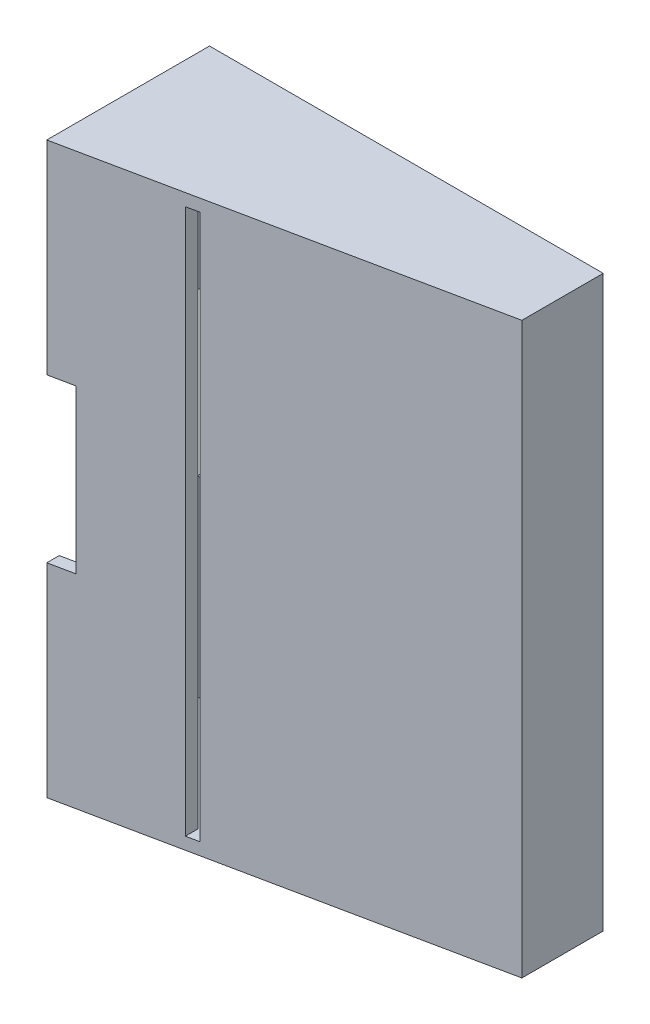
ISO-10303-21;
HEADER;
FILE_DESCRIPTION(('STEP AP214'),'2;1');
FILE_NAME('part.step','',(''),(''),'','','');
FILE_SCHEMA(('AUTOMOTIVE_DESIGN { 1 0 10303 214 1 1 1 1 }'));
ENDSEC;
DATA;
#1=APPLICATION_CONTEXT('core data for automotive mechanical design processes');
#2=APPLICATION_PROTOCOL_DEFINITION('international standard','automotive_design',2000,#1);
#3=PRODUCT_CONTEXT('',#1,'mechanical');
#4=PRODUCT('Part','Part','',(#3));
#5=PRODUCT_RELATED_PRODUCT_CATEGORY('part','',(#4));
#6=PRODUCT_DEFINITION_FORMATION('','',#4);
#7=PRODUCT_DEFINITION_CONTEXT('part definition',#1,'design');
#8=PRODUCT_DEFINITION('design','',#6,#7);
#9=PRODUCT_DEFINITION_SHAPE('','',#8);
#10=(LENGTH_UNIT() NAMED_UNIT(*) SI_UNIT(.MILLI.,.METRE.));
#11=(NAMED_UNIT(*) PLANE_ANGLE_UNIT() SI_UNIT($,.RADIAN.));
#12=(NAMED_UNIT(*) SI_UNIT($,.STERADIAN.) SOLID_ANGLE_UNIT());
#13=UNCERTAINTY_MEASURE_WITH_UNIT(LENGTH_MEASURE(1.E-05),#10,'distance_accuracy_value','');
#14=(GEOMETRIC_REPRESENTATION_CONTEXT(3) GLOBAL_UNCERTAINTY_ASSIGNED_CONTEXT((#13)) GLOBAL_UNIT_ASSIGNED_CONTEXT((#10,
#11,#12)) REPRESENTATION_CONTEXT('',''));
#15=CARTESIAN_POINT('',(0.,0.,0.));
#16=DIRECTION('',(0.,0.,1.));
#17=DIRECTION('',(1.,0.,0.));
#18=AXIS2_PLACEMENT_3D('',#15,#16,#17);
#19=CARTESIAN_POINT('',(0.,0.,0.));
#20=DIRECTION('',(0.,0.,1.));
#21=DIRECTION('',(1.,0.,0.));
#22=AXIS2_PLACEMENT_3D('',#19,#20,#21);
#23=PLANE('',#22);
#24=DIRECTION('',(1.,0.,0.));
#25=VECTOR('',#24,1.);
#26=CARTESIAN_POINT('',(0.,35.2499999999999,0.));
#27=LINE('',#26,#25);
#28=CARTESIAN_POINT('',(-46.8874953737982,35.2499999999999,0.));
#29=VERTEX_POINT('',#28);
#30=CARTESIAN_POINT('',(-43.8874953737976,35.2499999999999,0.));
#31=VERTEX_POINT('',#30);
#32=EDGE_CURVE('E325',#29,#31,#27,.T.);
#33=ORIENTED_EDGE('',*,*,#32,.F.);
#34=DIRECTION('',(0.,-1.,0.));
#35=VECTOR('',#34,1.);
#36=CARTESIAN_POINT('',(-46.8874953737991,1.23631995211119E-12,0.));
#37=LINE('',#36,#35);
#38=CARTESIAN_POINT('',(-46.8874953737975,60.2499999999998,0.));
#39=VERTEX_POINT('',#38);
#40=EDGE_CURVE('E329',#39,#29,#37,.T.);
#41=ORIENTED_EDGE('',*,*,#40,.F.);
#42=DIRECTION('',(-1.,0.,0.));
#43=VECTOR('',#42,1.);
#44=CARTESIAN_POINT('',(0.,60.2499999999998,0.));
#45=LINE('',#44,#43);
#46=CARTESIAN_POINT('',(1.5,60.2499999999998,0.));
#47=VERTEX_POINT('',#46);
#48=EDGE_CURVE('E348',#47,#39,#45,.T.);
#49=ORIENTED_EDGE('',*,*,#48,.F.);
#50=DIRECTION('',(0.,1.,0.));
#51=VECTOR('',#50,1.);
#52=CARTESIAN_POINT('',(1.5,0.,0.));
#53=LINE('',#52,#51);
#54=CARTESIAN_POINT('',(1.5,-9.75000000000003,0.));
#55=VERTEX_POINT('',#54);
#56=EDGE_CURVE('E345',#55,#47,#53,.T.);
#57=ORIENTED_EDGE('',*,*,#56,.F.);
#58=DIRECTION('',(1.,0.,0.));
#59=VECTOR('',#58,1.);
#60=CARTESIAN_POINT('',(0.,-9.75000000000003,0.));
#61=LINE('',#60,#59);
#62=CARTESIAN_POINT('',(-46.8874953737985,-9.75000000000003,0.));
#63=VERTEX_POINT('',#62);
#64=EDGE_CURVE('E342',#63,#55,#61,.T.);
#65=ORIENTED_EDGE('',*,*,#64,.F.);
#66=DIRECTION('',(0.,-1.,0.));
#67=VECTOR('',#66,1.);
#68=CARTESIAN_POINT('',(-46.8874953737985,3.2534735581873E-13,0.));
#69=LINE('',#68,#67);
#70=CARTESIAN_POINT('',(-46.8874953737983,15.2499999999999,0.));
#71=VERTEX_POINT('',#70);
#72=EDGE_CURVE('E340',#71,#63,#69,.T.);
#73=ORIENTED_EDGE('',*,*,#72,.F.);
#74=DIRECTION('',(-1.,0.,0.));
#75=VECTOR('',#74,1.);
#76=CARTESIAN_POINT('',(0.,15.2499999999998,0.));
#77=LINE('',#76,#75);
#78=CARTESIAN_POINT('',(-43.8874953737976,15.2499999999999,0.));
#79=VERTEX_POINT('',#78);
#80=EDGE_CURVE('E337',#79,#71,#77,.T.);
#81=ORIENTED_EDGE('',*,*,#80,.F.);
#82=DIRECTION('',(0.,-1.,0.));
#83=VECTOR('',#82,1.);
#84=CARTESIAN_POINT('',(-43.8874953737976,0.,0.));
#85=LINE('',#84,#83);
#86=EDGE_CURVE('E334',#31,#79,#85,.T.);
#87=ORIENTED_EDGE('',*,*,#86,.F.);
#88=EDGE_LOOP('',(#33,#41,#49,#57,#65,#73,#81,#87));
#89=FACE_BOUND('',#88,.T.);
#90=DIRECTION('',(-1.,0.,0.));
#91=VECTOR('',#90,1.);
#92=CARTESIAN_POINT('',(0.,-8.25000000000003,0.));
#93=LINE('',#92,#91);
#94=CARTESIAN_POINT('',(-31.27,-8.25000000000003,0.));
#95=VERTEX_POINT('',#94);
#96=CARTESIAN_POINT('',(-32.77,-8.25000000000003,0.));
#97=VERTEX_POINT('',#96);
#98=EDGE_CURVE('E224',#95,#97,#93,.T.);
#99=ORIENTED_EDGE('',*,*,#98,.F.);
#100=DIRECTION('',(0.,1.,0.));
#101=VECTOR('',#100,1.);
#102=CARTESIAN_POINT('',(-31.27,0.,0.));
#103=LINE('',#102,#101);
#104=CARTESIAN_POINT('',(-31.27,58.7499999999998,0.));
#105=VERTEX_POINT('',#104);
#106=EDGE_CURVE('E228',#95,#105,#103,.T.);
#107=ORIENTED_EDGE('',*,*,#106,.T.);
#108=DIRECTION('',(1.,0.,0.));
#109=VECTOR('',#108,1.);
#110=CARTESIAN_POINT('',(0.,58.7499999999998,0.));
#111=LINE('',#110,#109);
#112=CARTESIAN_POINT('',(-32.77,58.7499999999998,0.));
#113=VERTEX_POINT('',#112);
#114=EDGE_CURVE('E60',#113,#105,#111,.T.);
#115=ORIENTED_EDGE('',*,*,#114,.F.);
#116=DIRECTION('',(0.,1.,0.));
#117=VECTOR('',#116,1.);
#118=CARTESIAN_POINT('',(-32.77,0.,0.));
#119=LINE('',#118,#117);
#120=EDGE_CURVE('E217',#97,#113,#119,.T.);
#121=ORIENTED_EDGE('',*,*,#120,.F.);
#122=EDGE_LOOP('',(#99,#107,#115,#121));
#123=FACE_BOUND('',#122,.T.);
#124=ADVANCED_FACE('F45',(#89,#123),#23,.F.);
#125=CARTESIAN_POINT('',(2.04343913529051,60.2509999999998,9.8876901705508));
#126=DIRECTION('',(-0.202388113855779,0.,-0.979305392290832));
#127=DIRECTION('',(-0.979305392290832,0.,0.202388113855779));
#128=AXIS2_PLACEMENT_3D('',#125,#126,#127);
#129=PLANE('',#128);
#130=DIRECTION('',(0.979305392290832,0.,-0.202388113855779));
#131=VECTOR('',#130,1.);
#132=CARTESIAN_POINT('',(2.04343913529051,35.2499999999999,9.8876901705508));
#133=LINE('',#132,#131);
#134=CARTESIAN_POINT('',(-46.8874953737985,35.2499999999999,20.));
#135=VERTEX_POINT('',#134);
#136=CARTESIAN_POINT('',(-43.8874953737976,35.2499999999999,19.3800051073474));
#137=VERTEX_POINT('',#136);
#138=EDGE_CURVE('E323',#135,#137,#133,.T.);
#139=ORIENTED_EDGE('',*,*,#138,.T.);
#140=DIRECTION('',(0.,-1.,0.));
#141=VECTOR('',#140,1.);
#142=CARTESIAN_POINT('',(-43.8874953737976,60.2509999999998,19.3800051073474));
#143=LINE('',#142,#141);
#144=CARTESIAN_POINT('',(-43.8874953737976,15.2499999999999,19.3800051073474));
#145=VERTEX_POINT('',#144);
#146=EDGE_CURVE('E321',#137,#145,#143,.T.);
#147=ORIENTED_EDGE('',*,*,#146,.T.);
#148=DIRECTION('',(-0.979305392290832,0.,0.202388113855779));
#149=VECTOR('',#148,1.);
#150=CARTESIAN_POINT('',(2.04343913529048,15.2499999999998,9.88769017055081));
#151=LINE('',#150,#149);
#152=CARTESIAN_POINT('',(-46.8874953737983,15.2499999999999,20.));
#153=VERTEX_POINT('',#152);
#154=EDGE_CURVE('E319',#145,#153,#151,.T.);
#155=ORIENTED_EDGE('',*,*,#154,.T.);
#156=DIRECTION('',(0.,-1.,0.));
#157=VECTOR('',#156,1.);
#158=CARTESIAN_POINT('',(-46.8874953737985,3.2534735581873E-13,20.));
#159=LINE('',#158,#157);
#160=CARTESIAN_POINT('',(-46.8874953737985,-9.75000000000003,20.));
#161=VERTEX_POINT('',#160);
#162=EDGE_CURVE('E326',#153,#161,#159,.T.);
#163=ORIENTED_EDGE('',*,*,#162,.T.);
#164=DIRECTION('',(0.979305392290832,0.,-0.202388113855779));
#165=VECTOR('',#164,1.);
#166=CARTESIAN_POINT('',(2.04343913529051,-9.75000000000003,9.8876901705508));
#167=LINE('',#166,#165);
#168=CARTESIAN_POINT('',(1.5,-9.75000000000003,10.));
#169=VERTEX_POINT('',#168);
#170=EDGE_CURVE('E312',#161,#169,#167,.T.);
#171=ORIENTED_EDGE('',*,*,#170,.T.);
#172=DIRECTION('',(0.,-1.,0.));
#173=VECTOR('',#172,1.);
#174=CARTESIAN_POINT('',(1.5,60.2509999999998,10.));
#175=LINE('',#174,#173);
#176=CARTESIAN_POINT('',(1.5,60.2499999999998,10.));
#177=VERTEX_POINT('',#176);
#178=EDGE_CURVE('E314',#177,#169,#175,.T.);
#179=ORIENTED_EDGE('',*,*,#178,.F.);
#180=DIRECTION('',(-0.979305392290832,0.,0.202388113855779));
#181=VECTOR('',#180,1.);
#182=CARTESIAN_POINT('',(2.04343913529051,60.2499999999998,9.8876901705508));
#183=LINE('',#182,#181);
#184=CARTESIAN_POINT('',(-46.8874953737975,60.2499999999998,20.));
#185=VERTEX_POINT('',#184);
#186=EDGE_CURVE('E317',#177,#185,#183,.T.);
#187=ORIENTED_EDGE('',*,*,#186,.T.);
#188=DIRECTION('',(0.,-1.,0.));
#189=VECTOR('',#188,1.);
#190=CARTESIAN_POINT('',(-46.8874953737991,1.23631995211119E-12,20.));
#191=LINE('',#190,#189);
#192=EDGE_CURVE('E328',#185,#135,#191,.T.);
#193=ORIENTED_EDGE('',*,*,#192,.T.);
#194=EDGE_LOOP('',(#139,#147,#155,#163,#171,#179,#187,#193));
#195=FACE_BOUND('',#194,.T.);
#196=DIRECTION('',(-0.979305392290832,0.,0.202388113855779));
#197=VECTOR('',#196,1.);
#198=CARTESIAN_POINT('',(-14.7346264489013,-8.25000000000003,13.3551284941465));
#199=LINE('',#198,#197);
#200=CARTESIAN_POINT('',(-31.27,-8.25000000000003,16.7724108774071));
#201=VERTEX_POINT('',#200);
#202=CARTESIAN_POINT('',(-32.77,-8.25000000000003,17.0824083237334));
#203=VERTEX_POINT('',#202);
#204=EDGE_CURVE('E239',#201,#203,#199,.T.);
#205=ORIENTED_EDGE('',*,*,#204,.T.);
#206=DIRECTION('',(0.,1.,0.));
#207=VECTOR('',#206,1.);
#208=CARTESIAN_POINT('',(-32.77,0.,17.0824083237334));
#209=LINE('',#208,#207);
#210=CARTESIAN_POINT('',(-32.77,58.7499999999998,17.0824083237334));
#211=VERTEX_POINT('',#210);
#212=EDGE_CURVE('E235',#203,#211,#209,.T.);
#213=ORIENTED_EDGE('',*,*,#212,.T.);
#214=DIRECTION('',(0.979305392290832,0.,-0.202388113855779));
#215=VECTOR('',#214,1.);
#216=CARTESIAN_POINT('',(-14.7346264489013,58.7499999999998,13.3551284941465));
#217=LINE('',#216,#215);
#218=CARTESIAN_POINT('',(-31.27,58.7499999999998,16.7724108774071));
#219=VERTEX_POINT('',#218);
#220=EDGE_CURVE('E238',#211,#219,#217,.T.);
#221=ORIENTED_EDGE('',*,*,#220,.T.);
#222=DIRECTION('',(0.,1.,0.));
#223=VECTOR('',#222,1.);
#224=CARTESIAN_POINT('',(-31.27,0.,16.7724108774071));
#225=LINE('',#224,#223);
#226=EDGE_CURVE('E242',#201,#219,#225,.T.);
#227=ORIENTED_EDGE('',*,*,#226,.F.);
#228=EDGE_LOOP('',(#205,#213,#221,#227));
#229=FACE_BOUND('',#228,.T.);
#230=ADVANCED_FACE('F400',(#195,#229),#129,.F.);
#231=CARTESIAN_POINT('',(1.73985696450683,75.1134184450832,8.41873208211456));
#232=DIRECTION('',(0.202388113855779,0.,0.979305392290832));
#233=DIRECTION('',(0.979305392290832,0.,-0.202388113855779));
#234=AXIS2_PLACEMENT_3D('',#231,#232,#233);
#235=PLANE('',#234);
#236=DIRECTION('',(0.,1.,0.));
#237=VECTOR('',#236,1.);
#238=CARTESIAN_POINT('',(-32.77,75.1134184450832,15.550710436835));
#239=LINE('',#238,#237);
#240=CARTESIAN_POINT('',(-32.77,-8.25000000000003,15.550710436835));
#241=VERTEX_POINT('',#240);
#242=CARTESIAN_POINT('',(-32.77,58.7499999999998,15.550710436835));
#243=VERTEX_POINT('',#242);
#244=EDGE_CURVE('E259',#241,#243,#239,.T.);
#245=ORIENTED_EDGE('',*,*,#244,.F.);
#246=DIRECTION('',(-0.979305392290832,0.,0.202388113855779));
#247=VECTOR('',#246,1.);
#248=CARTESIAN_POINT('',(1.73985696450683,-8.25000000000003,8.41873208211456));
#249=LINE('',#248,#247);
#250=CARTESIAN_POINT('',(-46.8874953737985,-8.25000000000003,18.4683021131017));
#251=VERTEX_POINT('',#250);
#252=EDGE_CURVE('E290',#241,#251,#249,.T.);
#253=ORIENTED_EDGE('',*,*,#252,.T.);
#254=DIRECTION('',(0.,-1.,0.));
#255=VECTOR('',#254,1.);
#256=CARTESIAN_POINT('',(-46.8874953737985,3.2315086082598E-13,18.4683021131017));
#257=LINE('',#256,#255);
#258=CARTESIAN_POINT('',(-46.8874953737985,15.2499999999999,18.4683021131017));
#259=VERTEX_POINT('',#258);
#260=EDGE_CURVE('E12',#259,#251,#257,.T.);
#261=ORIENTED_EDGE('',*,*,#260,.F.);
#262=DIRECTION('',(-0.979305392290832,0.,0.202388113855779));
#263=VECTOR('',#262,1.);
#264=CARTESIAN_POINT('',(-2.22413846018386,15.2499999999998,9.23795105471655));
#265=LINE('',#264,#263);
#266=CARTESIAN_POINT('',(-43.8874953737976,15.2499999999999,17.848307220449));
#267=VERTEX_POINT('',#266);
#268=EDGE_CURVE('E306',#267,#259,#265,.T.);
#269=ORIENTED_EDGE('',*,*,#268,.F.);
#270=DIRECTION('',(0.,-1.,0.));
#271=VECTOR('',#270,1.);
#272=CARTESIAN_POINT('',(-43.8874953737976,0.,17.848307220449));
#273=LINE('',#272,#271);
#274=CARTESIAN_POINT('',(-43.8874953737976,35.2499999999999,17.848307220449));
#275=VERTEX_POINT('',#274);
#276=EDGE_CURVE('E309',#275,#267,#273,.T.);
#277=ORIENTED_EDGE('',*,*,#276,.F.);
#278=DIRECTION('',(-0.979305392290832,0.,0.202388113855779));
#279=VECTOR('',#278,1.);
#280=CARTESIAN_POINT('',(-2.22413846018387,35.2499999999999,9.23795105471656));
#281=LINE('',#280,#279);
#282=CARTESIAN_POINT('',(-46.8874953737985,35.2499999999999,18.4683021131017));
#283=VERTEX_POINT('',#282);
#284=EDGE_CURVE('E280',#275,#283,#281,.T.);
#285=ORIENTED_EDGE('',*,*,#284,.T.);
#286=DIRECTION('',(0.,1.,0.));
#287=VECTOR('',#286,1.);
#288=CARTESIAN_POINT('',(-46.8874953737985,-24.6134184450834,18.4683021131017));
#289=LINE('',#288,#287);
#290=CARTESIAN_POINT('',(-46.8874953737985,58.7499999999998,18.4683021131017));
#291=VERTEX_POINT('',#290);
#292=EDGE_CURVE('E272',#283,#291,#289,.T.);
#293=ORIENTED_EDGE('',*,*,#292,.T.);
#294=DIRECTION('',(-0.979305392290832,0.,0.202388113855779));
#295=VECTOR('',#294,1.);
#296=CARTESIAN_POINT('',(1.73985696450683,58.7499999999998,8.41873208211456));
#297=LINE('',#296,#295);
#298=EDGE_CURVE('E265',#243,#291,#297,.T.);
#299=ORIENTED_EDGE('',*,*,#298,.F.);
#300=EDGE_LOOP('',(#245,#253,#261,#269,#277,#285,#293,#299));
#301=FACE_BOUND('',#300,.T.);
#302=ADVANCED_FACE('F424',(#301),#235,.F.);
#303=CARTESIAN_POINT('',(0.,75.1134184450832,1.5));
#304=DIRECTION('',(0.,0.,-1.));
#305=DIRECTION('',(-1.,0.,0.));
#306=AXIS2_PLACEMENT_3D('',#303,#304,#305);
#307=PLANE('',#306);
#308=DIRECTION('',(0.,-1.,0.));
#309=VECTOR('',#308,1.);
#310=CARTESIAN_POINT('',(-32.77,75.1134184450832,1.5));
#311=LINE('',#310,#309);
#312=CARTESIAN_POINT('',(-32.77,58.7499999999998,1.5));
#313=VERTEX_POINT('',#312);
#314=CARTESIAN_POINT('',(-32.77,-8.25000000000003,1.5));
#315=VERTEX_POINT('',#314);
#316=EDGE_CURVE('E257',#313,#315,#311,.T.);
#317=ORIENTED_EDGE('',*,*,#316,.F.);
#318=DIRECTION('',(1.,0.,0.));
#319=VECTOR('',#318,1.);
#320=CARTESIAN_POINT('',(0.,58.7499999999998,1.5));
#321=LINE('',#320,#319);
#322=CARTESIAN_POINT('',(-46.8874953737985,58.7499999999998,1.5));
#323=VERTEX_POINT('',#322);
#324=EDGE_CURVE('E210',#323,#313,#321,.T.);
#325=ORIENTED_EDGE('',*,*,#324,.F.);
#326=DIRECTION('',(0.,1.,0.));
#327=VECTOR('',#326,1.);
#328=CARTESIAN_POINT('',(-46.8874953737985,-24.6134184450834,1.5));
#329=LINE('',#328,#327);
#330=CARTESIAN_POINT('',(-46.8874953737985,35.2499999999999,1.5));
#331=VERTEX_POINT('',#330);
#332=EDGE_CURVE('E271',#331,#323,#329,.T.);
#333=ORIENTED_EDGE('',*,*,#332,.F.);
#334=DIRECTION('',(1.,0.,0.));
#335=VECTOR('',#334,1.);
#336=CARTESIAN_POINT('',(0.,35.2499999999999,1.5));
#337=LINE('',#336,#335);
#338=CARTESIAN_POINT('',(-43.8874953737976,35.2499999999999,1.5));
#339=VERTEX_POINT('',#338);
#340=EDGE_CURVE('E275',#331,#339,#337,.T.);
#341=ORIENTED_EDGE('',*,*,#340,.T.);
#342=DIRECTION('',(0.,1.,0.));
#343=VECTOR('',#342,1.);
#344=CARTESIAN_POINT('',(-43.8874953737976,0.,1.5));
#345=LINE('',#344,#343);
#346=CARTESIAN_POINT('',(-43.8874953737976,15.2499999999999,1.5));
#347=VERTEX_POINT('',#346);
#348=EDGE_CURVE('E304',#347,#339,#345,.T.);
#349=ORIENTED_EDGE('',*,*,#348,.F.);
#350=DIRECTION('',(1.,0.,0.));
#351=VECTOR('',#350,1.);
#352=CARTESIAN_POINT('',(0.,15.2499999999998,1.5));
#353=LINE('',#352,#351);
#354=CARTESIAN_POINT('',(-46.8874953737983,15.2499999999999,1.5));
#355=VERTEX_POINT('',#354);
#356=EDGE_CURVE('E301',#355,#347,#353,.T.);
#357=ORIENTED_EDGE('',*,*,#356,.F.);
#358=DIRECTION('',(0.,1.,0.));
#359=VECTOR('',#358,1.);
#360=CARTESIAN_POINT('',(-46.8874953737985,3.2534735581873E-13,1.5));
#361=LINE('',#360,#359);
#362=CARTESIAN_POINT('',(-46.8874953737985,-8.25000000000003,1.5));
#363=VERTEX_POINT('',#362);
#364=EDGE_CURVE('E53',#363,#355,#361,.T.);
#365=ORIENTED_EDGE('',*,*,#364,.F.);
#366=DIRECTION('',(1.,0.,0.));
#367=VECTOR('',#366,1.);
#368=CARTESIAN_POINT('',(0.,-8.25000000000003,1.5));
#369=LINE('',#368,#367);
#370=EDGE_CURVE('E294',#363,#315,#369,.T.);
#371=ORIENTED_EDGE('',*,*,#370,.T.);
#372=EDGE_LOOP('',(#317,#325,#333,#341,#349,#357,#365,#371));
#373=FACE_BOUND('',#372,.T.);
#374=ADVANCED_FACE('F437',(#373),#307,.F.);
#375=CARTESIAN_POINT('',(0.,35.2499999999999,20.));
#376=DIRECTION('',(0.,1.,0.));
#377=DIRECTION('',(0.,0.,1.));
#378=AXIS2_PLACEMENT_3D('',#375,#376,#377);
#379=PLANE('',#378);
#380=ORIENTED_EDGE('',*,*,#284,.F.);
#381=DIRECTION('',(0.,0.,-1.));
#382=VECTOR('',#381,1.);
#383=CARTESIAN_POINT('',(-43.8874953737976,35.2499999999999,20.));
#384=LINE('',#383,#382);
#385=EDGE_CURVE('E374',#137,#275,#384,.T.);
#386=ORIENTED_EDGE('',*,*,#385,.F.);
#387=ORIENTED_EDGE('',*,*,#138,.F.);
#388=DIRECTION('',(0.,0.,-1.));
#389=VECTOR('',#388,1.);
#390=CARTESIAN_POINT('',(-46.8874953737982,35.2499999999999,20.));
#391=LINE('',#390,#389);
#392=EDGE_CURVE('E352',#135,#283,#391,.T.);
#393=ORIENTED_EDGE('',*,*,#392,.T.);
#394=EDGE_LOOP('',(#380,#386,#387,#393));
#395=FACE_BOUND('',#394,.T.);
#396=ADVANCED_FACE('F47',(#395),#379,.F.);
#397=ORIENTED_EDGE('',*,*,#340,.F.);
#398=EDGE_CURVE('E331',#331,#29,#391,.T.);
#399=ORIENTED_EDGE('',*,*,#398,.T.);
#400=ORIENTED_EDGE('',*,*,#32,.T.);
#401=EDGE_CURVE('E373',#339,#31,#384,.T.);
#402=ORIENTED_EDGE('',*,*,#401,.F.);
#403=EDGE_LOOP('',(#397,#399,#400,#402));
#404=FACE_BOUND('',#403,.T.);
#405=ADVANCED_FACE('F442',(#404),#379,.F.);
#406=CARTESIAN_POINT('',(-43.8874953737976,0.,20.));
#407=DIRECTION('',(1.,0.,0.));
#408=DIRECTION('',(0.,0.,-1.));
#409=AXIS2_PLACEMENT_3D('',#406,#407,#408);
#410=PLANE('',#409);
#411=ORIENTED_EDGE('',*,*,#385,.T.);
#412=ORIENTED_EDGE('',*,*,#276,.T.);
#413=DIRECTION('',(0.,0.,-1.));
#414=VECTOR('',#413,1.);
#415=CARTESIAN_POINT('',(-43.8874953737976,15.2499999999999,20.));
#416=LINE('',#415,#414);
#417=EDGE_CURVE('E370',#145,#267,#416,.T.);
#418=ORIENTED_EDGE('',*,*,#417,.F.);
#419=ORIENTED_EDGE('',*,*,#146,.F.);
#420=EDGE_LOOP('',(#411,#412,#418,#419));
#421=FACE_BOUND('',#420,.T.);
#422=ADVANCED_FACE('F426',(#421),#410,.F.);
#423=ORIENTED_EDGE('',*,*,#348,.T.);
#424=ORIENTED_EDGE('',*,*,#401,.T.);
#425=ORIENTED_EDGE('',*,*,#86,.T.);
#426=EDGE_CURVE('E369',#347,#79,#416,.T.);
#427=ORIENTED_EDGE('',*,*,#426,.F.);
#428=EDGE_LOOP('',(#423,#424,#425,#427));
#429=FACE_BOUND('',#428,.T.);
#430=ADVANCED_FACE('F445',(#429),#410,.F.);
#431=CARTESIAN_POINT('',(-46.8874953737991,1.23631995211119E-12,20.));
#432=DIRECTION('',(1.,0.,0.));
#433=DIRECTION('',(0.,1.,0.));
#434=AXIS2_PLACEMENT_3D('',#431,#432,#433);
#435=PLANE('',#434);
#436=ORIENTED_EDGE('',*,*,#292,.F.);
#437=ORIENTED_EDGE('',*,*,#392,.F.);
#438=ORIENTED_EDGE('',*,*,#192,.F.);
#439=DIRECTION('',(0.,0.,-1.));
#440=VECTOR('',#439,1.);
#441=CARTESIAN_POINT('',(-46.8874953737975,60.2499999999998,20.));
#442=LINE('',#441,#440);
#443=EDGE_CURVE('E355',#185,#39,#442,.T.);
#444=ORIENTED_EDGE('',*,*,#443,.T.);
#445=ORIENTED_EDGE('',*,*,#40,.T.);
#446=ORIENTED_EDGE('',*,*,#398,.F.);
#447=ORIENTED_EDGE('',*,*,#332,.T.);
#448=DIRECTION('',(0.,0.,-1.));
#449=VECTOR('',#448,1.);
#450=CARTESIAN_POINT('',(-46.8874953737985,58.7499999999998,0.));
#451=LINE('',#450,#449);
#452=EDGE_CURVE('E263',#291,#323,#451,.T.);
#453=ORIENTED_EDGE('',*,*,#452,.F.);
#454=EDGE_LOOP('',(#436,#437,#438,#444,#445,#446,#447,#453));
#455=FACE_BOUND('',#454,.T.);
#456=ADVANCED_FACE('F419',(#455),#435,.F.);
#457=CARTESIAN_POINT('',(0.,15.2499999999998,20.));
#458=DIRECTION('',(0.,-1.,0.));
#459=DIRECTION('',(1.,0.,0.));
#460=AXIS2_PLACEMENT_3D('',#457,#458,#459);
#461=PLANE('',#460);
#462=ORIENTED_EDGE('',*,*,#417,.T.);
#463=ORIENTED_EDGE('',*,*,#268,.T.);
#464=DIRECTION('',(0.,0.,-1.));
#465=VECTOR('',#464,1.);
#466=CARTESIAN_POINT('',(-46.8874953737983,15.2499999999999,20.));
#467=LINE('',#466,#465);
#468=EDGE_CURVE('E366',#153,#259,#467,.T.);
#469=ORIENTED_EDGE('',*,*,#468,.F.);
#470=ORIENTED_EDGE('',*,*,#154,.F.);
#471=EDGE_LOOP('',(#462,#463,#469,#470));
#472=FACE_BOUND('',#471,.T.);
#473=ADVANCED_FACE('F431',(#472),#461,.F.);
#474=EDGE_CURVE('E365',#355,#71,#467,.T.);
#475=ORIENTED_EDGE('',*,*,#474,.F.);
#476=ORIENTED_EDGE('',*,*,#356,.T.);
#477=ORIENTED_EDGE('',*,*,#426,.T.);
#478=ORIENTED_EDGE('',*,*,#80,.T.);
#479=EDGE_LOOP('',(#475,#476,#477,#478));
#480=FACE_BOUND('',#479,.T.);
#481=ADVANCED_FACE('F384',(#480),#461,.F.);
#482=CARTESIAN_POINT('',(-46.8874953737985,3.2534735581873E-13,20.));
#483=DIRECTION('',(1.,0.,0.));
#484=DIRECTION('',(0.,1.,0.));
#485=AXIS2_PLACEMENT_3D('',#482,#483,#484);
#486=PLANE('',#485);
#487=ORIENTED_EDGE('',*,*,#468,.T.);
#488=ORIENTED_EDGE('',*,*,#260,.T.);
#489=DIRECTION('',(0.,0.,-1.));
#490=VECTOR('',#489,1.);
#491=CARTESIAN_POINT('',(-46.8874953737985,-8.25000000000003,0.));
#492=LINE('',#491,#490);
#493=EDGE_CURVE('E283',#251,#363,#492,.T.);
#494=ORIENTED_EDGE('',*,*,#493,.T.);
#495=ORIENTED_EDGE('',*,*,#364,.T.);
#496=ORIENTED_EDGE('',*,*,#474,.T.);
#497=ORIENTED_EDGE('',*,*,#72,.T.);
#498=DIRECTION('',(0.,0.,-1.));
#499=VECTOR('',#498,1.);
#500=CARTESIAN_POINT('',(-46.8874953737985,-9.75000000000003,20.));
#501=LINE('',#500,#499);
#502=EDGE_CURVE('E362',#161,#63,#501,.T.);
#503=ORIENTED_EDGE('',*,*,#502,.F.);
#504=ORIENTED_EDGE('',*,*,#162,.F.);
#505=EDGE_LOOP('',(#487,#488,#494,#495,#496,#497,#503,#504));
#506=FACE_BOUND('',#505,.T.);
#507=ADVANCED_FACE('F379',(#506),#486,.F.);
#508=CARTESIAN_POINT('',(0.,-9.75000000000003,20.));
#509=DIRECTION('',(0.,1.,0.));
#510=DIRECTION('',(0.,0.,1.));
#511=AXIS2_PLACEMENT_3D('',#508,#509,#510);
#512=PLANE('',#511);
#513=DIRECTION('',(0.,0.,-1.));
#514=VECTOR('',#513,1.);
#515=CARTESIAN_POINT('',(1.5,-9.75000000000003,20.));
#516=LINE('',#515,#514);
#517=EDGE_CURVE('E360',#169,#55,#516,.T.);
#518=ORIENTED_EDGE('',*,*,#517,.F.);
#519=ORIENTED_EDGE('',*,*,#170,.F.);
#520=ORIENTED_EDGE('',*,*,#502,.T.);
#521=ORIENTED_EDGE('',*,*,#64,.T.);
#522=EDGE_LOOP('',(#518,#519,#520,#521));
#523=FACE_BOUND('',#522,.T.);
#524=ADVANCED_FACE('F398',(#523),#512,.F.);
#525=CARTESIAN_POINT('',(1.5,0.,20.));
#526=DIRECTION('',(-1.,0.,0.));
#527=DIRECTION('',(0.,0.,1.));
#528=AXIS2_PLACEMENT_3D('',#525,#526,#527);
#529=PLANE('',#528);
#530=DIRECTION('',(0.,0.,-1.));
#531=VECTOR('',#530,1.);
#532=CARTESIAN_POINT('',(1.5,60.2499999999998,20.));
#533=LINE('',#532,#531);
#534=EDGE_CURVE('E358',#177,#47,#533,.T.);
#535=ORIENTED_EDGE('',*,*,#534,.F.);
#536=ORIENTED_EDGE('',*,*,#178,.T.);
#537=ORIENTED_EDGE('',*,*,#517,.T.);
#538=ORIENTED_EDGE('',*,*,#56,.T.);
#539=EDGE_LOOP('',(#535,#536,#537,#538));
#540=FACE_BOUND('',#539,.T.);
#541=ADVANCED_FACE('F405',(#540),#529,.F.);
#542=CARTESIAN_POINT('',(0.,60.2499999999998,20.));
#543=DIRECTION('',(0.,-1.,0.));
#544=DIRECTION('',(0.,0.,-1.));
#545=AXIS2_PLACEMENT_3D('',#542,#543,#544);
#546=PLANE('',#545);
#547=ORIENTED_EDGE('',*,*,#443,.F.);
#548=ORIENTED_EDGE('',*,*,#186,.F.);
#549=ORIENTED_EDGE('',*,*,#534,.T.);
#550=ORIENTED_EDGE('',*,*,#48,.T.);
#551=EDGE_LOOP('',(#547,#548,#549,#550));
#552=FACE_BOUND('',#551,.T.);
#553=ADVANCED_FACE('F409',(#552),#546,.F.);
#554=CARTESIAN_POINT('',(0.,-8.25000000000003,8.77829955942791));
#555=VERTEX_POINT('',#554);
#556=CARTESIAN_POINT('',(-31.27,-8.25000000000003,15.2407129905088));
#557=VERTEX_POINT('',#556);
#558=EDGE_CURVE('E287',#555,#557,#249,.T.);
#559=ORIENTED_EDGE('',*,*,#558,.T.);
#560=DIRECTION('',(0.,1.,0.));
#561=VECTOR('',#560,1.);
#562=CARTESIAN_POINT('',(-31.27,75.1134184450832,15.2407129905088));
#563=LINE('',#562,#561);
#564=CARTESIAN_POINT('',(-31.27,58.7499999999998,15.2407129905088));
#565=VERTEX_POINT('',#564);
#566=EDGE_CURVE('E254',#557,#565,#563,.T.);
#567=ORIENTED_EDGE('',*,*,#566,.T.);
#568=CARTESIAN_POINT('',(0.,58.7499999999998,8.77829955942791));
#569=VERTEX_POINT('',#568);
#570=EDGE_CURVE('E266',#569,#565,#297,.T.);
#571=ORIENTED_EDGE('',*,*,#570,.F.);
#572=DIRECTION('',(0.,-1.,0.));
#573=VECTOR('',#572,1.);
#574=CARTESIAN_POINT('',(0.,75.1134184450832,8.77829955942791));
#575=LINE('',#574,#573);
#576=EDGE_CURVE('E286',#569,#555,#575,.T.);
#577=ORIENTED_EDGE('',*,*,#576,.T.);
#578=EDGE_LOOP('',(#559,#567,#571,#577));
#579=FACE_BOUND('',#578,.T.);
#580=ADVANCED_FACE('F463',(#579),#235,.F.);
#581=CARTESIAN_POINT('',(-31.27,58.7499999999998,1.5));
#582=VERTEX_POINT('',#581);
#583=CARTESIAN_POINT('',(0.,58.7499999999998,1.5));
#584=VERTEX_POINT('',#583);
#585=EDGE_CURVE('E261',#582,#584,#321,.T.);
#586=ORIENTED_EDGE('',*,*,#585,.F.);
#587=DIRECTION('',(0.,-1.,0.));
#588=VECTOR('',#587,1.);
#589=CARTESIAN_POINT('',(-31.27,75.1134184450832,1.5));
#590=LINE('',#589,#588);
#591=CARTESIAN_POINT('',(-31.27,-8.25000000000003,1.5));
#592=VERTEX_POINT('',#591);
#593=EDGE_CURVE('E243',#582,#592,#590,.T.);
#594=ORIENTED_EDGE('',*,*,#593,.T.);
#595=CARTESIAN_POINT('',(0.,-8.25000000000003,1.5));
#596=VERTEX_POINT('',#595);
#597=EDGE_CURVE('E282',#592,#596,#369,.T.);
#598=ORIENTED_EDGE('',*,*,#597,.T.);
#599=DIRECTION('',(0.,-1.,0.));
#600=VECTOR('',#599,1.);
#601=CARTESIAN_POINT('',(0.,75.1134184450832,1.5));
#602=LINE('',#601,#600);
#603=EDGE_CURVE('E298',#584,#596,#602,.T.);
#604=ORIENTED_EDGE('',*,*,#603,.F.);
#605=EDGE_LOOP('',(#586,#594,#598,#604));
#606=FACE_BOUND('',#605,.T.);
#607=ADVANCED_FACE('F527',(#606),#307,.F.);
#608=CARTESIAN_POINT('',(0.,-8.25000000000003,0.));
#609=DIRECTION('',(0.,-1.,0.));
#610=DIRECTION('',(0.,0.,-1.));
#611=AXIS2_PLACEMENT_3D('',#608,#609,#610);
#612=PLANE('',#611);
#613=ORIENTED_EDGE('',*,*,#597,.F.);
#614=DIRECTION('',(0.,0.,-1.));
#615=VECTOR('',#614,1.);
#616=CARTESIAN_POINT('',(-31.27,-8.25000000000003,84.6522954072327));
#617=LINE('',#616,#615);
#618=EDGE_CURVE('E229',#592,#95,#617,.T.);
#619=ORIENTED_EDGE('',*,*,#618,.T.);
#620=ORIENTED_EDGE('',*,*,#98,.T.);
#621=DIRECTION('',(0.,0.,-1.));
#622=VECTOR('',#621,1.);
#623=CARTESIAN_POINT('',(-32.77,-8.25000000000003,84.6522954072327));
#624=LINE('',#623,#622);
#625=EDGE_CURVE('E220',#315,#97,#624,.T.);
#626=ORIENTED_EDGE('',*,*,#625,.F.);
#627=ORIENTED_EDGE('',*,*,#370,.F.);
#628=ORIENTED_EDGE('',*,*,#493,.F.);
#629=ORIENTED_EDGE('',*,*,#252,.F.);
#630=EDGE_CURVE('E214',#203,#241,#624,.T.);
#631=ORIENTED_EDGE('',*,*,#630,.F.);
#632=ORIENTED_EDGE('',*,*,#204,.F.);
#633=EDGE_CURVE('E68',#201,#557,#617,.T.);
#634=ORIENTED_EDGE('',*,*,#633,.T.);
#635=ORIENTED_EDGE('',*,*,#558,.F.);
#636=DIRECTION('',(0.,0.,1.));
#637=VECTOR('',#636,1.);
#638=CARTESIAN_POINT('',(0.,-8.25000000000003,0.));
#639=LINE('',#638,#637);
#640=EDGE_CURVE('E291',#596,#555,#639,.T.);
#641=ORIENTED_EDGE('',*,*,#640,.F.);
#642=EDGE_LOOP('',(#613,#619,#620,#626,#627,#628,#629,#631,#632,#634,#635,#641));
#643=FACE_BOUND('',#642,.T.);
#644=ADVANCED_FACE('F436',(#643),#612,.F.);
#645=CARTESIAN_POINT('',(0.,75.1134184450832,0.));
#646=DIRECTION('',(1.,0.,0.));
#647=DIRECTION('',(0.,0.,-1.));
#648=AXIS2_PLACEMENT_3D('',#645,#646,#647);
#649=PLANE('',#648);
#650=ORIENTED_EDGE('',*,*,#603,.T.);
#651=ORIENTED_EDGE('',*,*,#640,.T.);
#652=ORIENTED_EDGE('',*,*,#576,.F.);
#653=DIRECTION('',(0.,0.,1.));
#654=VECTOR('',#653,1.);
#655=CARTESIAN_POINT('',(0.,58.7499999999998,0.));
#656=LINE('',#655,#654);
#657=EDGE_CURVE('E268',#584,#569,#656,.T.);
#658=ORIENTED_EDGE('',*,*,#657,.F.);
#659=EDGE_LOOP('',(#650,#651,#652,#658));
#660=FACE_BOUND('',#659,.T.);
#661=ADVANCED_FACE('F489',(#660),#649,.F.);
#662=CARTESIAN_POINT('',(0.,58.7499999999998,0.));
#663=DIRECTION('',(0.,1.,0.));
#664=DIRECTION('',(0.,0.,-1.));
#665=AXIS2_PLACEMENT_3D('',#662,#663,#664);
#666=PLANE('',#665);
#667=ORIENTED_EDGE('',*,*,#570,.T.);
#668=DIRECTION('',(0.,0.,-1.));
#669=VECTOR('',#668,1.);
#670=CARTESIAN_POINT('',(-31.27,58.7499999999998,84.6522954072327));
#671=LINE('',#670,#669);
#672=EDGE_CURVE('E248',#219,#565,#671,.T.);
#673=ORIENTED_EDGE('',*,*,#672,.F.);
#674=ORIENTED_EDGE('',*,*,#220,.F.);
#675=DIRECTION('',(0.,0.,-1.));
#676=VECTOR('',#675,1.);
#677=CARTESIAN_POINT('',(-32.77,58.7499999999998,84.6522954072327));
#678=LINE('',#677,#676);
#679=EDGE_CURVE('E213',#211,#243,#678,.T.);
#680=ORIENTED_EDGE('',*,*,#679,.T.);
#681=ORIENTED_EDGE('',*,*,#298,.T.);
#682=ORIENTED_EDGE('',*,*,#452,.T.);
#683=ORIENTED_EDGE('',*,*,#324,.T.);
#684=EDGE_CURVE('E205',#313,#113,#678,.T.);
#685=ORIENTED_EDGE('',*,*,#684,.T.);
#686=ORIENTED_EDGE('',*,*,#114,.T.);
#687=EDGE_CURVE('E247',#582,#105,#671,.T.);
#688=ORIENTED_EDGE('',*,*,#687,.F.);
#689=ORIENTED_EDGE('',*,*,#585,.T.);
#690=ORIENTED_EDGE('',*,*,#657,.T.);
#691=EDGE_LOOP('',(#667,#673,#674,#680,#681,#682,#683,#685,#686,#688,#689,#690));
#692=FACE_BOUND('',#691,.T.);
#693=ADVANCED_FACE('F208',(#692),#666,.F.);
#694=CARTESIAN_POINT('',(-31.27,0.,84.6522954072327));
#695=DIRECTION('',(1.,0.,0.));
#696=DIRECTION('',(0.,0.,-1.));
#697=AXIS2_PLACEMENT_3D('',#694,#695,#696);
#698=PLANE('',#697);
#699=ORIENTED_EDGE('',*,*,#687,.T.);
#700=ORIENTED_EDGE('',*,*,#106,.F.);
#701=ORIENTED_EDGE('',*,*,#618,.F.);
#702=ORIENTED_EDGE('',*,*,#593,.F.);
#703=EDGE_LOOP('',(#699,#700,#701,#702));
#704=FACE_BOUND('',#703,.T.);
#705=ADVANCED_FACE('F562',(#704),#698,.F.);
#706=CARTESIAN_POINT('',(-32.77,0.,84.6522954072327));
#707=DIRECTION('',(1.,0.,0.));
#708=DIRECTION('',(0.,0.,-1.));
#709=AXIS2_PLACEMENT_3D('',#706,#707,#708);
#710=PLANE('',#709);
#711=ORIENTED_EDGE('',*,*,#316,.T.);
#712=ORIENTED_EDGE('',*,*,#625,.T.);
#713=ORIENTED_EDGE('',*,*,#120,.T.);
#714=ORIENTED_EDGE('',*,*,#684,.F.);
#715=EDGE_LOOP('',(#711,#712,#713,#714));
#716=FACE_BOUND('',#715,.T.);
#717=ADVANCED_FACE('F218',(#716),#710,.T.);
#718=ORIENTED_EDGE('',*,*,#244,.T.);
#719=ORIENTED_EDGE('',*,*,#679,.F.);
#720=ORIENTED_EDGE('',*,*,#212,.F.);
#721=ORIENTED_EDGE('',*,*,#630,.T.);
#722=EDGE_LOOP('',(#718,#719,#720,#721));
#723=FACE_BOUND('',#722,.T.);
#724=ADVANCED_FACE('F581',(#723),#710,.T.);
#725=ORIENTED_EDGE('',*,*,#633,.F.);
#726=ORIENTED_EDGE('',*,*,#226,.T.);
#727=ORIENTED_EDGE('',*,*,#672,.T.);
#728=ORIENTED_EDGE('',*,*,#566,.F.);
#729=EDGE_LOOP('',(#725,#726,#727,#728));
#730=FACE_BOUND('',#729,.T.);
#731=ADVANCED_FACE('F573',(#730),#698,.F.);
#732=CLOSED_SHELL('',(#124,#230,#302,#374,#396,#405,#422,#430,#456,#473,#481,#507,#524,#541,
#553,#580,#607,#644,#661,#693,#705,#717,#724,#731));
#733=MANIFOLD_SOLID_BREP('B2',#732);
#734=CARTESIAN_POINT('',(-43.9874953737976,35.1499999999999,-21.5112468377161));
#735=DIRECTION('',(0.,1.,0.));
#736=DIRECTION('',(0.,0.,1.));
#737=AXIS2_PLACEMENT_3D('',#734,#735,#736);
#738=PLANE('',#737);
#739=DIRECTION('',(1.,0.,0.));
#740=VECTOR('',#739,1.);
#741=CARTESIAN_POINT('',(-43.9874953737976,35.1499999999999,-1.49999999999997));
#742=LINE('',#741,#740);
#743=CARTESIAN_POINT('',(-46.8874953737982,35.1499999999999,-1.49999999999997));
#744=VERTEX_POINT('',#743);
#745=CARTESIAN_POINT('',(-43.9874953737976,35.1499999999999,-1.49999999999997));
#746=VERTEX_POINT('',#745);
#747=EDGE_CURVE('E43',#744,#746,#742,.T.);
#748=ORIENTED_EDGE('',*,*,#747,.F.);
#749=DIRECTION('',(0.,0.,1.));
#750=VECTOR('',#749,1.);
#751=CARTESIAN_POINT('',(-46.8874953737982,35.1499999999999,-21.5112468377161));
#752=LINE('',#751,#750);
#753=CARTESIAN_POINT('',(-46.8874953737982,35.1499999999999,0.));
#754=VERTEX_POINT('',#753);
#755=EDGE_CURVE('E682',#744,#754,#752,.T.);
#756=ORIENTED_EDGE('',*,*,#755,.T.);
#757=DIRECTION('',(-1.,0.,0.));
#758=VECTOR('',#757,1.);
#759=CARTESIAN_POINT('',(-43.9874953737976,35.1499999999999,0.));
#760=LINE('',#759,#758);
#761=CARTESIAN_POINT('',(-43.9874953737976,35.1499999999999,0.));
#762=VERTEX_POINT('',#761);
#763=EDGE_CURVE('E766',#762,#754,#760,.T.);
#764=ORIENTED_EDGE('',*,*,#763,.F.);
#765=DIRECTION('',(0.,0.,1.));
#766=VECTOR('',#765,1.);
#767=CARTESIAN_POINT('',(-43.9874953737976,35.1499999999999,-21.5112468377161));
#768=LINE('',#767,#766);
#769=EDGE_CURVE('E776',#746,#762,#768,.T.);
#770=ORIENTED_EDGE('',*,*,#769,.F.);
#771=EDGE_LOOP('',(#748,#756,#764,#770));
#772=FACE_BOUND('',#771,.T.);
#773=ADVANCED_FACE('F679',(#772),#738,.T.);
#774=CARTESIAN_POINT('',(-43.9874953737976,15.3499999999999,-21.5112468377161));
#775=DIRECTION('',(1.,0.,0.));
#776=DIRECTION('',(0.,0.,-1.));
#777=AXIS2_PLACEMENT_3D('',#774,#775,#776);
#778=PLANE('',#777);
#779=DIRECTION('',(0.,-1.,0.));
#780=VECTOR('',#779,1.);
#781=CARTESIAN_POINT('',(-43.9874953737976,15.3499999999999,-1.49999999999997));
#782=LINE('',#781,#780);
#783=CARTESIAN_POINT('',(-43.9874953737976,15.3499999999999,-1.49999999999997));
#784=VERTEX_POINT('',#783);
#785=EDGE_CURVE('E688',#746,#784,#782,.T.);
#786=ORIENTED_EDGE('',*,*,#785,.F.);
#787=ORIENTED_EDGE('',*,*,#769,.T.);
#788=DIRECTION('',(0.,1.,0.));
#789=VECTOR('',#788,1.);
#790=CARTESIAN_POINT('',(-43.9874953737976,15.3499999999999,0.));
#791=LINE('',#790,#789);
#792=CARTESIAN_POINT('',(-43.9874953737976,15.3499999999999,0.));
#793=VERTEX_POINT('',#792);
#794=EDGE_CURVE('E784',#793,#762,#791,.T.);
#795=ORIENTED_EDGE('',*,*,#794,.F.);
#796=DIRECTION('',(0.,0.,1.));
#797=VECTOR('',#796,1.);
#798=CARTESIAN_POINT('',(-43.9874953737976,15.3499999999999,-21.5112468377161));
#799=LINE('',#798,#797);
#800=EDGE_CURVE('E788',#784,#793,#799,.T.);
#801=ORIENTED_EDGE('',*,*,#800,.F.);
#802=EDGE_LOOP('',(#786,#787,#795,#801));
#803=FACE_BOUND('',#802,.T.);
#804=ADVANCED_FACE('F804',(#803),#778,.T.);
#805=CARTESIAN_POINT('',(-46.8874953737983,15.3499999999999,-21.5112468377161));
#806=DIRECTION('',(0.,-1.,0.));
#807=DIRECTION('',(1.,0.,0.));
#808=AXIS2_PLACEMENT_3D('',#805,#806,#807);
#809=PLANE('',#808);
#810=DIRECTION('',(-1.,0.,0.));
#811=VECTOR('',#810,1.);
#812=CARTESIAN_POINT('',(-46.8874953737983,15.3499999999999,-1.49999999999997));
#813=LINE('',#812,#811);
#814=CARTESIAN_POINT('',(-46.8874953737984,15.3499999999999,-1.49999999999997));
#815=VERTEX_POINT('',#814);
#816=EDGE_CURVE('E695',#784,#815,#813,.T.);
#817=ORIENTED_EDGE('',*,*,#816,.F.);
#818=ORIENTED_EDGE('',*,*,#800,.T.);
#819=DIRECTION('',(1.,0.,0.));
#820=VECTOR('',#819,1.);
#821=CARTESIAN_POINT('',(-46.8874953737983,15.3499999999999,0.));
#822=LINE('',#821,#820);
#823=CARTESIAN_POINT('',(-46.8874953737983,15.3499999999999,0.));
#824=VERTEX_POINT('',#823);
#825=EDGE_CURVE('E781',#824,#793,#822,.T.);
#826=ORIENTED_EDGE('',*,*,#825,.F.);
#827=DIRECTION('',(0.,0.,1.));
#828=VECTOR('',#827,1.);
#829=CARTESIAN_POINT('',(-46.8874953737983,15.3499999999999,-21.5112468377161));
#830=LINE('',#829,#828);
#831=EDGE_CURVE('E789',#815,#824,#830,.T.);
#832=ORIENTED_EDGE('',*,*,#831,.F.);
#833=EDGE_LOOP('',(#817,#818,#826,#832));
#834=FACE_BOUND('',#833,.T.);
#835=ADVANCED_FACE('F837',(#834),#809,.T.);
#836=CARTESIAN_POINT('',(-46.8874953737983,15.3499999999999,-21.5112468377161));
#837=DIRECTION('',(-1.,0.,0.));
#838=DIRECTION('',(0.,-1.,0.));
#839=AXIS2_PLACEMENT_3D('',#836,#837,#838);
#840=PLANE('',#839);
#841=ORIENTED_EDGE('',*,*,#755,.F.);
#842=DIRECTION('',(0.,1.,0.));
#843=VECTOR('',#842,1.);
#844=CARTESIAN_POINT('',(-46.8874953737984,12.3499999999999,-1.49999999999997));
#845=LINE('',#844,#843);
#846=CARTESIAN_POINT('',(-46.8874953737984,38.1499999999999,-1.49999999999997));
#847=VERTEX_POINT('',#846);
#848=EDGE_CURVE('E808',#744,#847,#845,.T.);
#849=ORIENTED_EDGE('',*,*,#848,.T.);
#850=DIRECTION('',(0.,0.,1.));
#851=VECTOR('',#850,1.);
#852=CARTESIAN_POINT('',(-46.8874953737984,38.1499999999999,-2.99999999999997));
#853=LINE('',#852,#851);
#854=CARTESIAN_POINT('',(-46.8874953737984,38.1499999999999,-2.99999999999997));
#855=VERTEX_POINT('',#854);
#856=EDGE_CURVE('E771',#855,#847,#853,.T.);
#857=ORIENTED_EDGE('',*,*,#856,.F.);
#858=DIRECTION('',(0.,1.,0.));
#859=VECTOR('',#858,1.);
#860=CARTESIAN_POINT('',(-46.8874953737984,12.3499999999999,-2.99999999999997));
#861=LINE('',#860,#859);
#862=CARTESIAN_POINT('',(-46.8874953737984,12.3499999999999,-2.99999999999997));
#863=VERTEX_POINT('',#862);
#864=EDGE_CURVE('E751',#863,#855,#861,.T.);
#865=ORIENTED_EDGE('',*,*,#864,.F.);
#866=DIRECTION('',(0.,0.,1.));
#867=VECTOR('',#866,1.);
#868=CARTESIAN_POINT('',(-46.8874953737984,12.3499999999999,-2.99999999999997));
#869=LINE('',#868,#867);
#870=CARTESIAN_POINT('',(-46.8874953737984,12.3499999999999,-1.49999999999997));
#871=VERTEX_POINT('',#870);
#872=EDGE_CURVE('E748',#863,#871,#869,.T.);
#873=ORIENTED_EDGE('',*,*,#872,.T.);
#874=EDGE_CURVE('E811',#871,#815,#845,.T.);
#875=ORIENTED_EDGE('',*,*,#874,.T.);
#876=ORIENTED_EDGE('',*,*,#831,.T.);
#877=DIRECTION('',(0.,-1.,0.));
#878=VECTOR('',#877,1.);
#879=CARTESIAN_POINT('',(-46.8874953737983,15.3499999999999,0.));
#880=LINE('',#879,#878);
#881=EDGE_CURVE('E769',#754,#824,#880,.T.);
#882=ORIENTED_EDGE('',*,*,#881,.F.);
#883=EDGE_LOOP('',(#841,#849,#857,#865,#873,#875,#876,#882));
#884=FACE_BOUND('',#883,.T.);
#885=ADVANCED_FACE('F799',(#884),#840,.T.);
#886=CARTESIAN_POINT('',(0.,0.,0.));
#887=DIRECTION('',(0.,0.,-1.));
#888=DIRECTION('',(-1.,0.,0.));
#889=AXIS2_PLACEMENT_3D('',#886,#887,#888);
#890=PLANE('',#889);
#891=ORIENTED_EDGE('',*,*,#763,.T.);
#892=ORIENTED_EDGE('',*,*,#881,.T.);
#893=ORIENTED_EDGE('',*,*,#825,.T.);
#894=ORIENTED_EDGE('',*,*,#794,.T.);
#895=EDGE_LOOP('',(#891,#892,#893,#894));
#896=FACE_BOUND('',#895,.T.);
#897=ADVANCED_FACE('F801',(#896),#890,.F.);
#898=CARTESIAN_POINT('',(0.,0.,-1.49999999999997));
#899=DIRECTION('',(0.,0.,-1.));
#900=DIRECTION('',(-1.,0.,0.));
#901=AXIS2_PLACEMENT_3D('',#898,#899,#900);
#902=PLANE('',#901);
#903=ORIENTED_EDGE('',*,*,#848,.F.);
#904=ORIENTED_EDGE('',*,*,#747,.T.);
#905=ORIENTED_EDGE('',*,*,#785,.T.);
#906=ORIENTED_EDGE('',*,*,#816,.T.);
#907=ORIENTED_EDGE('',*,*,#874,.F.);
#908=DIRECTION('',(-1.,0.,0.));
#909=VECTOR('',#908,1.);
#910=CARTESIAN_POINT('',(-46.8874953737984,12.3499999999999,-1.49999999999997));
#911=LINE('',#910,#909);
#912=CARTESIAN_POINT('',(-24.3874953737981,12.3499999999999,-1.49999999999997));
#913=VERTEX_POINT('',#912);
#914=EDGE_CURVE('E812',#913,#871,#911,.T.);
#915=ORIENTED_EDGE('',*,*,#914,.F.);
#916=DIRECTION('',(0.,-1.,0.));
#917=VECTOR('',#916,1.);
#918=CARTESIAN_POINT('',(-24.3874953737981,12.3499999999999,-1.49999999999997));
#919=LINE('',#918,#917);
#920=CARTESIAN_POINT('',(-24.3874953737981,38.1499999999999,-1.49999999999997));
#921=VERTEX_POINT('',#920);
#922=EDGE_CURVE('E765',#921,#913,#919,.T.);
#923=ORIENTED_EDGE('',*,*,#922,.F.);
#924=DIRECTION('',(1.,0.,0.));
#925=VECTOR('',#924,1.);
#926=CARTESIAN_POINT('',(-46.8874953737984,38.1499999999999,-1.49999999999997));
#927=LINE('',#926,#925);
#928=EDGE_CURVE('E761',#847,#921,#927,.T.);
#929=ORIENTED_EDGE('',*,*,#928,.F.);
#930=EDGE_LOOP('',(#903,#904,#905,#906,#907,#915,#923,#929));
#931=FACE_BOUND('',#930,.T.);
#932=ADVANCED_FACE('F806',(#931),#902,.F.);
#933=CARTESIAN_POINT('',(-24.3874953737981,12.3499999999999,-2.99999999999997));
#934=DIRECTION('',(-1.,0.,0.));
#935=DIRECTION('',(0.,0.,1.));
#936=AXIS2_PLACEMENT_3D('',#933,#934,#935);
#937=PLANE('',#936);
#938=ORIENTED_EDGE('',*,*,#922,.T.);
#939=DIRECTION('',(0.,0.,1.));
#940=VECTOR('',#939,1.);
#941=CARTESIAN_POINT('',(-24.3874953737981,12.3499999999999,-2.99999999999997));
#942=LINE('',#941,#940);
#943=CARTESIAN_POINT('',(-24.3874953737981,12.3499999999999,-2.99999999999997));
#944=VERTEX_POINT('',#943);
#945=EDGE_CURVE('E745',#944,#913,#942,.T.);
#946=ORIENTED_EDGE('',*,*,#945,.F.);
#947=DIRECTION('',(0.,-1.,0.));
#948=VECTOR('',#947,1.);
#949=CARTESIAN_POINT('',(-24.3874953737981,12.3499999999999,-2.99999999999997));
#950=LINE('',#949,#948);
#951=CARTESIAN_POINT('',(-24.3874953737981,38.1499999999999,-2.99999999999997));
#952=VERTEX_POINT('',#951);
#953=EDGE_CURVE('E752',#952,#944,#950,.T.);
#954=ORIENTED_EDGE('',*,*,#953,.F.);
#955=DIRECTION('',(0.,0.,1.));
#956=VECTOR('',#955,1.);
#957=CARTESIAN_POINT('',(-24.3874953737981,38.1499999999999,-2.99999999999997));
#958=LINE('',#957,#956);
#959=EDGE_CURVE('E818',#952,#921,#958,.T.);
#960=ORIENTED_EDGE('',*,*,#959,.T.);
#961=EDGE_LOOP('',(#938,#946,#954,#960));
#962=FACE_BOUND('',#961,.T.);
#963=ADVANCED_FACE('F763',(#962),#937,.F.);
#964=CARTESIAN_POINT('',(-46.8874953737984,12.3499999999999,-2.99999999999997));
#965=DIRECTION('',(0.,1.,0.));
#966=DIRECTION('',(0.,0.,1.));
#967=AXIS2_PLACEMENT_3D('',#964,#965,#966);
#968=PLANE('',#967);
#969=ORIENTED_EDGE('',*,*,#914,.T.);
#970=ORIENTED_EDGE('',*,*,#872,.F.);
#971=DIRECTION('',(-1.,0.,0.));
#972=VECTOR('',#971,1.);
#973=CARTESIAN_POINT('',(-46.8874953737984,12.3499999999999,-2.99999999999997));
#974=LINE('',#973,#972);
#975=EDGE_CURVE('E741',#944,#863,#974,.T.);
#976=ORIENTED_EDGE('',*,*,#975,.F.);
#977=ORIENTED_EDGE('',*,*,#945,.T.);
#978=EDGE_LOOP('',(#969,#970,#976,#977));
#979=FACE_BOUND('',#978,.T.);
#980=ADVANCED_FACE('F743',(#979),#968,.F.);
#981=CARTESIAN_POINT('',(-46.8874953737984,38.1499999999999,-2.99999999999997));
#982=DIRECTION('',(0.,-1.,0.));
#983=DIRECTION('',(0.,0.,-1.));
#984=AXIS2_PLACEMENT_3D('',#981,#982,#983);
#985=PLANE('',#984);
#986=ORIENTED_EDGE('',*,*,#928,.T.);
#987=ORIENTED_EDGE('',*,*,#959,.F.);
#988=DIRECTION('',(1.,0.,0.));
#989=VECTOR('',#988,1.);
#990=CARTESIAN_POINT('',(-46.8874953737984,38.1499999999999,-2.99999999999997));
#991=LINE('',#990,#989);
#992=EDGE_CURVE('E757',#855,#952,#991,.T.);
#993=ORIENTED_EDGE('',*,*,#992,.F.);
#994=ORIENTED_EDGE('',*,*,#856,.T.);
#995=EDGE_LOOP('',(#986,#987,#993,#994));
#996=FACE_BOUND('',#995,.T.);
#997=ADVANCED_FACE('F820',(#996),#985,.F.);
#998=CARTESIAN_POINT('',(0.,0.,-2.99999999999997));
#999=DIRECTION('',(0.,0.,-1.));
#1000=DIRECTION('',(-1.,0.,0.));
#1001=AXIS2_PLACEMENT_3D('',#998,#999,#1000);
#1002=PLANE('',#1001);
#1003=ORIENTED_EDGE('',*,*,#953,.T.);
#1004=ORIENTED_EDGE('',*,*,#975,.T.);
#1005=ORIENTED_EDGE('',*,*,#864,.T.);
#1006=ORIENTED_EDGE('',*,*,#992,.T.);
#1007=EDGE_LOOP('',(#1003,#1004,#1005,#1006));
#1008=FACE_BOUND('',#1007,.T.);
#1009=ADVANCED_FACE('F755',(#1008),#1002,.T.);
#1010=CLOSED_SHELL('',(#773,#804,#835,#885,#897,#932,#963,#980,#997,#1009));
#1011=MANIFOLD_SOLID_BREP('B6',#1010);
#1012=ADVANCED_BREP_SHAPE_REPRESENTATION('',(#18,#733,#1011),#14);
#1013=SHAPE_DEFINITION_REPRESENTATION(#9,#1012);
ENDSEC;
END-ISO-10303-21;
